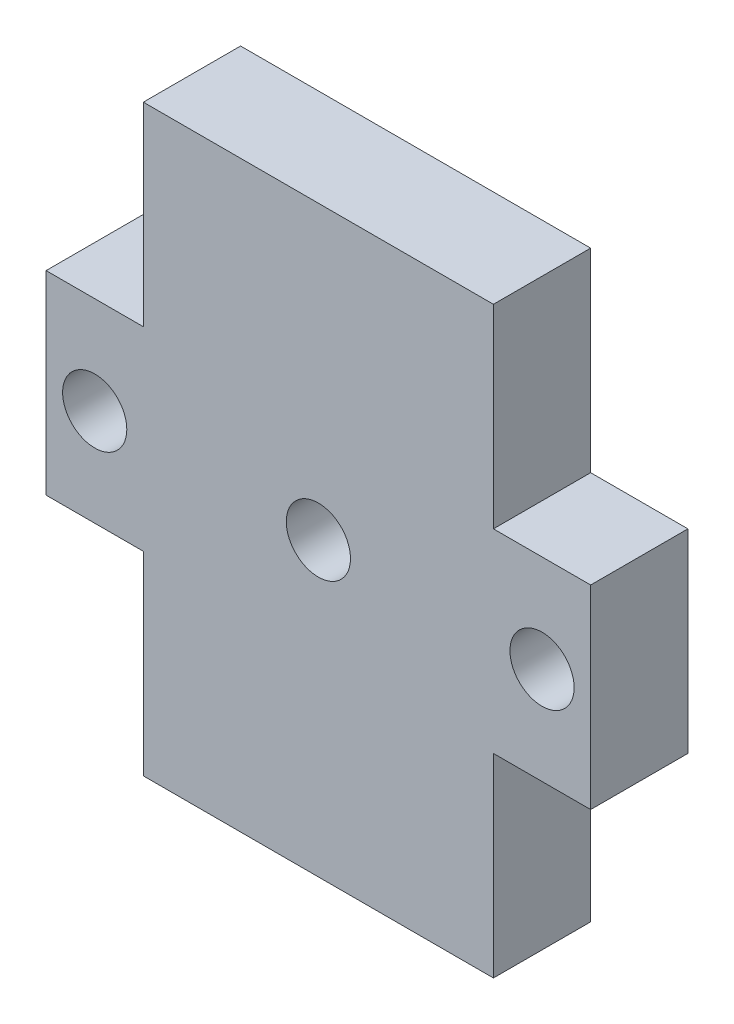
ISO-10303-21;
HEADER;
FILE_DESCRIPTION(('STEP AP214'),'2;1');
FILE_NAME('part.step','',(''),(''),'','','');
FILE_SCHEMA(('AUTOMOTIVE_DESIGN { 1 0 10303 214 1 1 1 1 }'));
ENDSEC;
DATA;
#1=APPLICATION_CONTEXT('core data for automotive mechanical design processes');
#2=APPLICATION_PROTOCOL_DEFINITION('international standard','automotive_design',2000,#1);
#3=PRODUCT_CONTEXT('',#1,'mechanical');
#4=PRODUCT('Part','Part','',(#3));
#5=PRODUCT_RELATED_PRODUCT_CATEGORY('part','',(#4));
#6=PRODUCT_DEFINITION_FORMATION('','',#4);
#7=PRODUCT_DEFINITION_CONTEXT('part definition',#1,'design');
#8=PRODUCT_DEFINITION('design','',#6,#7);
#9=PRODUCT_DEFINITION_SHAPE('','',#8);
#10=(LENGTH_UNIT() NAMED_UNIT(*) SI_UNIT(.MILLI.,.METRE.));
#11=(NAMED_UNIT(*) PLANE_ANGLE_UNIT() SI_UNIT($,.RADIAN.));
#12=(NAMED_UNIT(*) SI_UNIT($,.STERADIAN.) SOLID_ANGLE_UNIT());
#13=UNCERTAINTY_MEASURE_WITH_UNIT(LENGTH_MEASURE(1.E-05),#10,'distance_accuracy_value','');
#14=(GEOMETRIC_REPRESENTATION_CONTEXT(3) GLOBAL_UNCERTAINTY_ASSIGNED_CONTEXT((#13)) GLOBAL_UNIT_ASSIGNED_CONTEXT((#10,
#11,#12)) REPRESENTATION_CONTEXT('',''));
#15=CARTESIAN_POINT('',(0.,0.,0.));
#16=DIRECTION('',(0.,0.,1.));
#17=DIRECTION('',(1.,0.,0.));
#18=AXIS2_PLACEMENT_3D('',#15,#16,#17);
#19=CARTESIAN_POINT('',(-17.78,-19.05,6.35));
#20=DIRECTION('',(1.,0.,0.));
#21=DIRECTION('',(0.,1.,0.));
#22=AXIS2_PLACEMENT_3D('',#19,#20,#21);
#23=PLANE('',#22);
#24=DIRECTION('',(0.,-1.,0.));
#25=VECTOR('',#24,1.);
#26=CARTESIAN_POINT('',(-17.78,-19.05,0.));
#27=LINE('',#26,#25);
#28=CARTESIAN_POINT('',(-17.78,6.35,0.));
#29=VERTEX_POINT('',#28);
#30=CARTESIAN_POINT('',(-17.78,-6.35,0.));
#31=VERTEX_POINT('',#30);
#32=EDGE_CURVE('E146',#29,#31,#27,.T.);
#33=ORIENTED_EDGE('',*,*,#32,.T.);
#34=DIRECTION('',(0.,0.,1.));
#35=VECTOR('',#34,1.);
#36=CARTESIAN_POINT('',(-17.78,-6.35,0.));
#37=LINE('',#36,#35);
#38=CARTESIAN_POINT('',(-17.78,-6.35,6.35));
#39=VERTEX_POINT('',#38);
#40=EDGE_CURVE('E204',#31,#39,#37,.T.);
#41=ORIENTED_EDGE('',*,*,#40,.T.);
#42=DIRECTION('',(0.,-1.,0.));
#43=VECTOR('',#42,1.);
#44=CARTESIAN_POINT('',(-17.78,-19.05,6.35));
#45=LINE('',#44,#43);
#46=CARTESIAN_POINT('',(-17.78,6.35,6.35));
#47=VERTEX_POINT('',#46);
#48=EDGE_CURVE('E156',#47,#39,#45,.T.);
#49=ORIENTED_EDGE('',*,*,#48,.F.);
#50=DIRECTION('',(0.,0.,1.));
#51=VECTOR('',#50,1.);
#52=CARTESIAN_POINT('',(-17.78,6.35,0.));
#53=LINE('',#52,#51);
#54=EDGE_CURVE('E192',#29,#47,#53,.T.);
#55=ORIENTED_EDGE('',*,*,#54,.F.);
#56=EDGE_LOOP('',(#33,#41,#49,#55));
#57=FACE_BOUND('',#56,.T.);
#58=ADVANCED_FACE('F33',(#57),#23,.F.);
#59=CARTESIAN_POINT('',(17.78,-19.05,6.35));
#60=DIRECTION('',(0.,1.,0.));
#61=DIRECTION('',(-1.,0.,0.));
#62=AXIS2_PLACEMENT_3D('',#59,#60,#61);
#63=PLANE('',#62);
#64=DIRECTION('',(1.,0.,0.));
#65=VECTOR('',#64,1.);
#66=CARTESIAN_POINT('',(17.78,-19.05,6.35));
#67=LINE('',#66,#65);
#68=CARTESIAN_POINT('',(-11.43,-19.05,6.35));
#69=VERTEX_POINT('',#68);
#70=CARTESIAN_POINT('',(11.43,-19.05,6.35));
#71=VERTEX_POINT('',#70);
#72=EDGE_CURVE('E139',#69,#71,#67,.T.);
#73=ORIENTED_EDGE('',*,*,#72,.F.);
#74=DIRECTION('',(0.,0.,1.));
#75=VECTOR('',#74,1.);
#76=CARTESIAN_POINT('',(-11.43,-19.05,0.));
#77=LINE('',#76,#75);
#78=CARTESIAN_POINT('',(-11.43,-19.05,0.));
#79=VERTEX_POINT('',#78);
#80=EDGE_CURVE('E126',#79,#69,#77,.T.);
#81=ORIENTED_EDGE('',*,*,#80,.F.);
#82=DIRECTION('',(1.,0.,0.));
#83=VECTOR('',#82,1.);
#84=CARTESIAN_POINT('',(17.78,-19.05,0.));
#85=LINE('',#84,#83);
#86=CARTESIAN_POINT('',(11.43,-19.05,0.));
#87=VERTEX_POINT('',#86);
#88=EDGE_CURVE('E137',#79,#87,#85,.T.);
#89=ORIENTED_EDGE('',*,*,#88,.T.);
#90=DIRECTION('',(0.,0.,1.));
#91=VECTOR('',#90,1.);
#92=CARTESIAN_POINT('',(11.43,-19.05,0.));
#93=LINE('',#92,#91);
#94=EDGE_CURVE('E150',#87,#71,#93,.T.);
#95=ORIENTED_EDGE('',*,*,#94,.T.);
#96=EDGE_LOOP('',(#73,#81,#89,#95));
#97=FACE_BOUND('',#96,.T.);
#98=ADVANCED_FACE('F135',(#97),#63,.F.);
#99=CARTESIAN_POINT('',(17.78,-19.05,6.35));
#100=DIRECTION('',(-1.,0.,0.));
#101=DIRECTION('',(0.,0.,1.));
#102=AXIS2_PLACEMENT_3D('',#99,#100,#101);
#103=PLANE('',#102);
#104=DIRECTION('',(0.,1.,0.));
#105=VECTOR('',#104,1.);
#106=CARTESIAN_POINT('',(17.78,-19.05,0.));
#107=LINE('',#106,#105);
#108=CARTESIAN_POINT('',(17.78,-6.35,0.));
#109=VERTEX_POINT('',#108);
#110=CARTESIAN_POINT('',(17.78,6.35000000000001,0.));
#111=VERTEX_POINT('',#110);
#112=EDGE_CURVE('E145',#109,#111,#107,.T.);
#113=ORIENTED_EDGE('',*,*,#112,.T.);
#114=DIRECTION('',(0.,0.,1.));
#115=VECTOR('',#114,1.);
#116=CARTESIAN_POINT('',(17.78,6.35000000000001,0.));
#117=LINE('',#116,#115);
#118=CARTESIAN_POINT('',(17.78,6.35000000000001,6.35));
#119=VERTEX_POINT('',#118);
#120=EDGE_CURVE('E171',#111,#119,#117,.T.);
#121=ORIENTED_EDGE('',*,*,#120,.T.);
#122=DIRECTION('',(0.,1.,0.));
#123=VECTOR('',#122,1.);
#124=CARTESIAN_POINT('',(17.78,-19.05,6.35));
#125=LINE('',#124,#123);
#126=CARTESIAN_POINT('',(17.78,-6.35,6.35));
#127=VERTEX_POINT('',#126);
#128=EDGE_CURVE('E41',#127,#119,#125,.T.);
#129=ORIENTED_EDGE('',*,*,#128,.F.);
#130=DIRECTION('',(0.,0.,1.));
#131=VECTOR('',#130,1.);
#132=CARTESIAN_POINT('',(17.78,-6.35,0.));
#133=LINE('',#132,#131);
#134=EDGE_CURVE('E159',#109,#127,#133,.T.);
#135=ORIENTED_EDGE('',*,*,#134,.F.);
#136=EDGE_LOOP('',(#113,#121,#129,#135));
#137=FACE_BOUND('',#136,.T.);
#138=ADVANCED_FACE('F277',(#137),#103,.F.);
#139=CARTESIAN_POINT('',(17.78,19.05,6.35));
#140=DIRECTION('',(0.,-1.,0.));
#141=DIRECTION('',(1.,0.,0.));
#142=AXIS2_PLACEMENT_3D('',#139,#140,#141);
#143=PLANE('',#142);
#144=DIRECTION('',(-1.,0.,0.));
#145=VECTOR('',#144,1.);
#146=CARTESIAN_POINT('',(17.78,19.05,0.));
#147=LINE('',#146,#145);
#148=CARTESIAN_POINT('',(11.43,19.05,0.));
#149=VERTEX_POINT('',#148);
#150=CARTESIAN_POINT('',(-11.43,19.05,0.));
#151=VERTEX_POINT('',#150);
#152=EDGE_CURVE('E36',#149,#151,#147,.T.);
#153=ORIENTED_EDGE('',*,*,#152,.T.);
#154=DIRECTION('',(0.,0.,1.));
#155=VECTOR('',#154,1.);
#156=CARTESIAN_POINT('',(-11.43,19.05,0.));
#157=LINE('',#156,#155);
#158=CARTESIAN_POINT('',(-11.43,19.05,6.35));
#159=VERTEX_POINT('',#158);
#160=EDGE_CURVE('E187',#151,#159,#157,.T.);
#161=ORIENTED_EDGE('',*,*,#160,.T.);
#162=DIRECTION('',(-1.,0.,0.));
#163=VECTOR('',#162,1.);
#164=CARTESIAN_POINT('',(17.78,19.05,6.35));
#165=LINE('',#164,#163);
#166=CARTESIAN_POINT('',(11.43,19.05,6.35));
#167=VERTEX_POINT('',#166);
#168=EDGE_CURVE('E11',#167,#159,#165,.T.);
#169=ORIENTED_EDGE('',*,*,#168,.F.);
#170=DIRECTION('',(0.,0.,1.));
#171=VECTOR('',#170,1.);
#172=CARTESIAN_POINT('',(11.43,19.05,0.));
#173=LINE('',#172,#171);
#174=EDGE_CURVE('E174',#149,#167,#173,.T.);
#175=ORIENTED_EDGE('',*,*,#174,.F.);
#176=EDGE_LOOP('',(#153,#161,#169,#175));
#177=FACE_BOUND('',#176,.T.);
#178=ADVANCED_FACE('F246',(#177),#143,.F.);
#179=CARTESIAN_POINT('',(0.,0.,6.35));
#180=DIRECTION('',(0.,0.,1.));
#181=DIRECTION('',(1.,0.,0.));
#182=AXIS2_PLACEMENT_3D('',#179,#180,#181);
#183=PLANE('',#182);
#184=CARTESIAN_POINT('',(0.,0.,6.35));
#185=DIRECTION('',(0.,0.,1.));
#186=DIRECTION('',(1.,0.,0.));
#187=AXIS2_PLACEMENT_3D('',#184,#185,#186);
#188=CIRCLE('',#187,2.0955);
#189=CARTESIAN_POINT('',(2.0955,0.,6.35));
#190=VERTEX_POINT('',#189);
#191=EDGE_CURVE('E228',#190,#190,#188,.T.);
#192=ORIENTED_EDGE('',*,*,#191,.F.);
#193=EDGE_LOOP('',(#192));
#194=FACE_BOUND('',#193,.T.);
#195=CARTESIAN_POINT('',(-14.605,0.,6.35));
#196=DIRECTION('',(0.,0.,1.));
#197=DIRECTION('',(1.,0.,0.));
#198=AXIS2_PLACEMENT_3D('',#195,#196,#197);
#199=CIRCLE('',#198,2.0955);
#200=CARTESIAN_POINT('',(-12.5095,0.,6.35));
#201=VERTEX_POINT('',#200);
#202=EDGE_CURVE('E222',#201,#201,#199,.T.);
#203=ORIENTED_EDGE('',*,*,#202,.F.);
#204=EDGE_LOOP('',(#203));
#205=FACE_BOUND('',#204,.T.);
#206=CARTESIAN_POINT('',(14.605,0.,6.35));
#207=DIRECTION('',(0.,0.,1.));
#208=DIRECTION('',(1.,0.,0.));
#209=AXIS2_PLACEMENT_3D('',#206,#207,#208);
#210=CIRCLE('',#209,2.0955);
#211=CARTESIAN_POINT('',(16.7005,0.,6.35));
#212=VERTEX_POINT('',#211);
#213=EDGE_CURVE('E216',#212,#212,#210,.T.);
#214=ORIENTED_EDGE('',*,*,#213,.F.);
#215=EDGE_LOOP('',(#214));
#216=FACE_BOUND('',#215,.T.);
#217=DIRECTION('',(-1.,0.,0.));
#218=VECTOR('',#217,1.);
#219=CARTESIAN_POINT('',(-17.78,-6.35,6.35));
#220=LINE('',#219,#218);
#221=CARTESIAN_POINT('',(-11.43,-6.35,6.35));
#222=VERTEX_POINT('',#221);
#223=EDGE_CURVE('E131',#222,#39,#220,.T.);
#224=ORIENTED_EDGE('',*,*,#223,.F.);
#225=DIRECTION('',(0.,1.,0.));
#226=VECTOR('',#225,1.);
#227=CARTESIAN_POINT('',(-11.43,-19.05,6.35));
#228=LINE('',#227,#226);
#229=EDGE_CURVE('E212',#69,#222,#228,.T.);
#230=ORIENTED_EDGE('',*,*,#229,.F.);
#231=ORIENTED_EDGE('',*,*,#72,.T.);
#232=DIRECTION('',(0.,-1.,0.));
#233=VECTOR('',#232,1.);
#234=CARTESIAN_POINT('',(11.43,-19.05,6.35));
#235=LINE('',#234,#233);
#236=CARTESIAN_POINT('',(11.43,-6.35,6.35));
#237=VERTEX_POINT('',#236);
#238=EDGE_CURVE('E164',#237,#71,#235,.T.);
#239=ORIENTED_EDGE('',*,*,#238,.F.);
#240=DIRECTION('',(-1.,0.,0.));
#241=VECTOR('',#240,1.);
#242=CARTESIAN_POINT('',(17.78,-6.35,6.35));
#243=LINE('',#242,#241);
#244=EDGE_CURVE('E168',#127,#237,#243,.T.);
#245=ORIENTED_EDGE('',*,*,#244,.F.);
#246=ORIENTED_EDGE('',*,*,#128,.T.);
#247=DIRECTION('',(1.,0.,0.));
#248=VECTOR('',#247,1.);
#249=CARTESIAN_POINT('',(17.78,6.35000000000001,6.35));
#250=LINE('',#249,#248);
#251=CARTESIAN_POINT('',(11.43,6.35000000000001,6.35));
#252=VERTEX_POINT('',#251);
#253=EDGE_CURVE('E181',#252,#119,#250,.T.);
#254=ORIENTED_EDGE('',*,*,#253,.F.);
#255=DIRECTION('',(0.,-1.,0.));
#256=VECTOR('',#255,1.);
#257=CARTESIAN_POINT('',(11.43,19.05,6.35));
#258=LINE('',#257,#256);
#259=EDGE_CURVE('E184',#167,#252,#258,.T.);
#260=ORIENTED_EDGE('',*,*,#259,.F.);
#261=ORIENTED_EDGE('',*,*,#168,.T.);
#262=DIRECTION('',(0.,1.,0.));
#263=VECTOR('',#262,1.);
#264=CARTESIAN_POINT('',(-11.43,19.05,6.35));
#265=LINE('',#264,#263);
#266=CARTESIAN_POINT('',(-11.43,6.35,6.35));
#267=VERTEX_POINT('',#266);
#268=EDGE_CURVE('E198',#267,#159,#265,.T.);
#269=ORIENTED_EDGE('',*,*,#268,.F.);
#270=DIRECTION('',(1.,0.,0.));
#271=VECTOR('',#270,1.);
#272=CARTESIAN_POINT('',(-17.78,6.35,6.35));
#273=LINE('',#272,#271);
#274=EDGE_CURVE('E201',#47,#267,#273,.T.);
#275=ORIENTED_EDGE('',*,*,#274,.F.);
#276=ORIENTED_EDGE('',*,*,#48,.T.);
#277=EDGE_LOOP('',(#224,#230,#231,#239,#245,#246,#254,#260,#261,#269,#275,#276));
#278=FACE_BOUND('',#277,.T.);
#279=ADVANCED_FACE('F243',(#194,#205,#216,#278),#183,.T.);
#280=CARTESIAN_POINT('',(0.,0.,0.));
#281=DIRECTION('',(0.,0.,1.));
#282=DIRECTION('',(1.,0.,0.));
#283=AXIS2_PLACEMENT_3D('',#280,#281,#282);
#284=PLANE('',#283);
#285=CARTESIAN_POINT('',(0.,0.,0.));
#286=DIRECTION('',(0.,0.,1.));
#287=DIRECTION('',(1.,0.,0.));
#288=AXIS2_PLACEMENT_3D('',#285,#286,#287);
#289=CIRCLE('',#288,2.0955);
#290=CARTESIAN_POINT('',(2.0955,0.,0.));
#291=VERTEX_POINT('',#290);
#292=EDGE_CURVE('E225',#291,#291,#289,.T.);
#293=ORIENTED_EDGE('',*,*,#292,.T.);
#294=EDGE_LOOP('',(#293));
#295=FACE_BOUND('',#294,.T.);
#296=CARTESIAN_POINT('',(-14.605,0.,0.));
#297=DIRECTION('',(0.,0.,1.));
#298=DIRECTION('',(1.,0.,0.));
#299=AXIS2_PLACEMENT_3D('',#296,#297,#298);
#300=CIRCLE('',#299,2.0955);
#301=CARTESIAN_POINT('',(-12.5095,0.,0.));
#302=VERTEX_POINT('',#301);
#303=EDGE_CURVE('E219',#302,#302,#300,.T.);
#304=ORIENTED_EDGE('',*,*,#303,.T.);
#305=EDGE_LOOP('',(#304));
#306=FACE_BOUND('',#305,.T.);
#307=CARTESIAN_POINT('',(14.605,0.,0.));
#308=DIRECTION('',(0.,0.,1.));
#309=DIRECTION('',(1.,0.,0.));
#310=AXIS2_PLACEMENT_3D('',#307,#308,#309);
#311=CIRCLE('',#310,2.0955);
#312=CARTESIAN_POINT('',(16.7005,0.,0.));
#313=VERTEX_POINT('',#312);
#314=EDGE_CURVE('E214',#313,#313,#311,.T.);
#315=ORIENTED_EDGE('',*,*,#314,.T.);
#316=EDGE_LOOP('',(#315));
#317=FACE_BOUND('',#316,.T.);
#318=DIRECTION('',(0.,1.,0.));
#319=VECTOR('',#318,1.);
#320=CARTESIAN_POINT('',(-11.43,-19.05,0.));
#321=LINE('',#320,#319);
#322=CARTESIAN_POINT('',(-11.43,-6.35,0.));
#323=VERTEX_POINT('',#322);
#324=EDGE_CURVE('E122',#79,#323,#321,.T.);
#325=ORIENTED_EDGE('',*,*,#324,.T.);
#326=DIRECTION('',(-1.,0.,0.));
#327=VECTOR('',#326,1.);
#328=CARTESIAN_POINT('',(-17.78,-6.35,0.));
#329=LINE('',#328,#327);
#330=EDGE_CURVE('E49',#323,#31,#329,.T.);
#331=ORIENTED_EDGE('',*,*,#330,.T.);
#332=ORIENTED_EDGE('',*,*,#32,.F.);
#333=DIRECTION('',(1.,0.,0.));
#334=VECTOR('',#333,1.);
#335=CARTESIAN_POINT('',(-17.78,6.35,0.));
#336=LINE('',#335,#334);
#337=CARTESIAN_POINT('',(-11.43,6.35,0.));
#338=VERTEX_POINT('',#337);
#339=EDGE_CURVE('E200',#29,#338,#336,.T.);
#340=ORIENTED_EDGE('',*,*,#339,.T.);
#341=DIRECTION('',(0.,1.,0.));
#342=VECTOR('',#341,1.);
#343=CARTESIAN_POINT('',(-11.43,19.05,0.));
#344=LINE('',#343,#342);
#345=EDGE_CURVE('E57',#338,#151,#344,.T.);
#346=ORIENTED_EDGE('',*,*,#345,.T.);
#347=ORIENTED_EDGE('',*,*,#152,.F.);
#348=DIRECTION('',(0.,-1.,0.));
#349=VECTOR('',#348,1.);
#350=CARTESIAN_POINT('',(11.43,19.05,0.));
#351=LINE('',#350,#349);
#352=CARTESIAN_POINT('',(11.43,6.35000000000001,0.));
#353=VERTEX_POINT('',#352);
#354=EDGE_CURVE('E183',#149,#353,#351,.T.);
#355=ORIENTED_EDGE('',*,*,#354,.T.);
#356=DIRECTION('',(1.,0.,0.));
#357=VECTOR('',#356,1.);
#358=CARTESIAN_POINT('',(17.78,6.35000000000001,0.));
#359=LINE('',#358,#357);
#360=EDGE_CURVE('E177',#353,#111,#359,.T.);
#361=ORIENTED_EDGE('',*,*,#360,.T.);
#362=ORIENTED_EDGE('',*,*,#112,.F.);
#363=DIRECTION('',(-1.,0.,0.));
#364=VECTOR('',#363,1.);
#365=CARTESIAN_POINT('',(17.78,-6.35,0.));
#366=LINE('',#365,#364);
#367=CARTESIAN_POINT('',(11.43,-6.35,0.));
#368=VERTEX_POINT('',#367);
#369=EDGE_CURVE('E167',#109,#368,#366,.T.);
#370=ORIENTED_EDGE('',*,*,#369,.T.);
#371=DIRECTION('',(0.,-1.,0.));
#372=VECTOR('',#371,1.);
#373=CARTESIAN_POINT('',(11.43,-19.05,0.));
#374=LINE('',#373,#372);
#375=EDGE_CURVE('E144',#368,#87,#374,.T.);
#376=ORIENTED_EDGE('',*,*,#375,.T.);
#377=ORIENTED_EDGE('',*,*,#88,.F.);
#378=EDGE_LOOP('',(#325,#331,#332,#340,#346,#347,#355,#361,#362,#370,#376,#377));
#379=FACE_BOUND('',#378,.T.);
#380=ADVANCED_FACE('F142',(#295,#306,#317,#379),#284,.F.);
#381=CARTESIAN_POINT('',(11.43,-19.05,0.));
#382=DIRECTION('',(-1.,0.,0.));
#383=DIRECTION('',(0.,0.,1.));
#384=AXIS2_PLACEMENT_3D('',#381,#382,#383);
#385=PLANE('',#384);
#386=ORIENTED_EDGE('',*,*,#238,.T.);
#387=ORIENTED_EDGE('',*,*,#94,.F.);
#388=ORIENTED_EDGE('',*,*,#375,.F.);
#389=DIRECTION('',(0.,0.,1.));
#390=VECTOR('',#389,1.);
#391=CARTESIAN_POINT('',(11.43,-6.35,0.));
#392=LINE('',#391,#390);
#393=EDGE_CURVE('E161',#368,#237,#392,.T.);
#394=ORIENTED_EDGE('',*,*,#393,.T.);
#395=EDGE_LOOP('',(#386,#387,#388,#394));
#396=FACE_BOUND('',#395,.T.);
#397=ADVANCED_FACE('F285',(#396),#385,.F.);
#398=CARTESIAN_POINT('',(17.78,-6.35,0.));
#399=DIRECTION('',(0.,1.,0.));
#400=DIRECTION('',(-1.,0.,0.));
#401=AXIS2_PLACEMENT_3D('',#398,#399,#400);
#402=PLANE('',#401);
#403=ORIENTED_EDGE('',*,*,#244,.T.);
#404=ORIENTED_EDGE('',*,*,#393,.F.);
#405=ORIENTED_EDGE('',*,*,#369,.F.);
#406=ORIENTED_EDGE('',*,*,#134,.T.);
#407=EDGE_LOOP('',(#403,#404,#405,#406));
#408=FACE_BOUND('',#407,.T.);
#409=ADVANCED_FACE('F281',(#408),#402,.F.);
#410=CARTESIAN_POINT('',(17.78,6.35000000000001,0.));
#411=DIRECTION('',(0.,-1.,0.));
#412=DIRECTION('',(1.,0.,0.));
#413=AXIS2_PLACEMENT_3D('',#410,#411,#412);
#414=PLANE('',#413);
#415=ORIENTED_EDGE('',*,*,#253,.T.);
#416=ORIENTED_EDGE('',*,*,#120,.F.);
#417=ORIENTED_EDGE('',*,*,#360,.F.);
#418=DIRECTION('',(0.,0.,1.));
#419=VECTOR('',#418,1.);
#420=CARTESIAN_POINT('',(11.43,6.35000000000001,0.));
#421=LINE('',#420,#419);
#422=EDGE_CURVE('E176',#353,#252,#421,.T.);
#423=ORIENTED_EDGE('',*,*,#422,.T.);
#424=EDGE_LOOP('',(#415,#416,#417,#423));
#425=FACE_BOUND('',#424,.T.);
#426=ADVANCED_FACE('F292',(#425),#414,.F.);
#427=CARTESIAN_POINT('',(11.43,19.05,0.));
#428=DIRECTION('',(-1.,0.,0.));
#429=DIRECTION('',(0.,-1.,0.));
#430=AXIS2_PLACEMENT_3D('',#427,#428,#429);
#431=PLANE('',#430);
#432=ORIENTED_EDGE('',*,*,#259,.T.);
#433=ORIENTED_EDGE('',*,*,#422,.F.);
#434=ORIENTED_EDGE('',*,*,#354,.F.);
#435=ORIENTED_EDGE('',*,*,#174,.T.);
#436=EDGE_LOOP('',(#432,#433,#434,#435));
#437=FACE_BOUND('',#436,.T.);
#438=ADVANCED_FACE('F272',(#437),#431,.F.);
#439=CARTESIAN_POINT('',(-11.43,19.05,0.));
#440=DIRECTION('',(1.,0.,0.));
#441=DIRECTION('',(0.,0.,-1.));
#442=AXIS2_PLACEMENT_3D('',#439,#440,#441);
#443=PLANE('',#442);
#444=ORIENTED_EDGE('',*,*,#268,.T.);
#445=ORIENTED_EDGE('',*,*,#160,.F.);
#446=ORIENTED_EDGE('',*,*,#345,.F.);
#447=DIRECTION('',(0.,0.,1.));
#448=VECTOR('',#447,1.);
#449=CARTESIAN_POINT('',(-11.43,6.35,0.));
#450=LINE('',#449,#448);
#451=EDGE_CURVE('E194',#338,#267,#450,.T.);
#452=ORIENTED_EDGE('',*,*,#451,.T.);
#453=EDGE_LOOP('',(#444,#445,#446,#452));
#454=FACE_BOUND('',#453,.T.);
#455=ADVANCED_FACE('F264',(#454),#443,.F.);
#456=CARTESIAN_POINT('',(-17.78,6.35,0.));
#457=DIRECTION('',(0.,-1.,0.));
#458=DIRECTION('',(1.,0.,0.));
#459=AXIS2_PLACEMENT_3D('',#456,#457,#458);
#460=PLANE('',#459);
#461=ORIENTED_EDGE('',*,*,#274,.T.);
#462=ORIENTED_EDGE('',*,*,#451,.F.);
#463=ORIENTED_EDGE('',*,*,#339,.F.);
#464=ORIENTED_EDGE('',*,*,#54,.T.);
#465=EDGE_LOOP('',(#461,#462,#463,#464));
#466=FACE_BOUND('',#465,.T.);
#467=ADVANCED_FACE('F262',(#466),#460,.F.);
#468=CARTESIAN_POINT('',(-17.78,-6.35,0.));
#469=DIRECTION('',(0.,1.,0.));
#470=DIRECTION('',(-1.,0.,0.));
#471=AXIS2_PLACEMENT_3D('',#468,#469,#470);
#472=PLANE('',#471);
#473=ORIENTED_EDGE('',*,*,#223,.T.);
#474=ORIENTED_EDGE('',*,*,#40,.F.);
#475=ORIENTED_EDGE('',*,*,#330,.F.);
#476=DIRECTION('',(0.,0.,1.));
#477=VECTOR('',#476,1.);
#478=CARTESIAN_POINT('',(-11.43,-6.35,0.));
#479=LINE('',#478,#477);
#480=EDGE_CURVE('E128',#323,#222,#479,.T.);
#481=ORIENTED_EDGE('',*,*,#480,.T.);
#482=EDGE_LOOP('',(#473,#474,#475,#481));
#483=FACE_BOUND('',#482,.T.);
#484=ADVANCED_FACE('F255',(#483),#472,.F.);
#485=CARTESIAN_POINT('',(-11.43,-19.05,0.));
#486=DIRECTION('',(1.,0.,0.));
#487=DIRECTION('',(0.,0.,-1.));
#488=AXIS2_PLACEMENT_3D('',#485,#486,#487);
#489=PLANE('',#488);
#490=ORIENTED_EDGE('',*,*,#229,.T.);
#491=ORIENTED_EDGE('',*,*,#480,.F.);
#492=ORIENTED_EDGE('',*,*,#324,.F.);
#493=ORIENTED_EDGE('',*,*,#80,.T.);
#494=EDGE_LOOP('',(#490,#491,#492,#493));
#495=FACE_BOUND('',#494,.T.);
#496=ADVANCED_FACE('F125',(#495),#489,.F.);
#497=CARTESIAN_POINT('',(14.605,0.,0.));
#498=DIRECTION('',(0.,0.,1.));
#499=DIRECTION('',(1.,0.,0.));
#500=AXIS2_PLACEMENT_3D('',#497,#498,#499);
#501=CYLINDRICAL_SURFACE('',#500,2.0955);
#502=ORIENTED_EDGE('',*,*,#314,.F.);
#503=EDGE_LOOP('',(#502));
#504=FACE_BOUND('',#503,.T.);
#505=ORIENTED_EDGE('',*,*,#213,.T.);
#506=EDGE_LOOP('',(#505));
#507=FACE_BOUND('',#506,.T.);
#508=ADVANCED_FACE('F369',(#504,#507),#501,.F.);
#509=CARTESIAN_POINT('',(-14.605,0.,0.));
#510=DIRECTION('',(0.,0.,1.));
#511=DIRECTION('',(1.,0.,0.));
#512=AXIS2_PLACEMENT_3D('',#509,#510,#511);
#513=CYLINDRICAL_SURFACE('',#512,2.0955);
#514=ORIENTED_EDGE('',*,*,#303,.F.);
#515=EDGE_LOOP('',(#514));
#516=FACE_BOUND('',#515,.T.);
#517=ORIENTED_EDGE('',*,*,#202,.T.);
#518=EDGE_LOOP('',(#517));
#519=FACE_BOUND('',#518,.T.);
#520=ADVANCED_FACE('F239',(#516,#519),#513,.F.);
#521=CARTESIAN_POINT('',(0.,0.,0.));
#522=DIRECTION('',(0.,0.,1.));
#523=DIRECTION('',(1.,0.,0.));
#524=AXIS2_PLACEMENT_3D('',#521,#522,#523);
#525=CYLINDRICAL_SURFACE('',#524,2.0955);
#526=ORIENTED_EDGE('',*,*,#292,.F.);
#527=EDGE_LOOP('',(#526));
#528=FACE_BOUND('',#527,.T.);
#529=ORIENTED_EDGE('',*,*,#191,.T.);
#530=EDGE_LOOP('',(#529));
#531=FACE_BOUND('',#530,.T.);
#532=ADVANCED_FACE('F236',(#528,#531),#525,.F.);
#533=CLOSED_SHELL('',(#58,#98,#138,#178,#279,#380,#397,#409,#426,#438,#455,#467,#484,#496,#508,
#520,#532));
#534=MANIFOLD_SOLID_BREP('B2',#533);
#535=ADVANCED_BREP_SHAPE_REPRESENTATION('',(#18,#534),#14);
#536=SHAPE_DEFINITION_REPRESENTATION(#9,#535);
ENDSEC;
END-ISO-10303-21;
